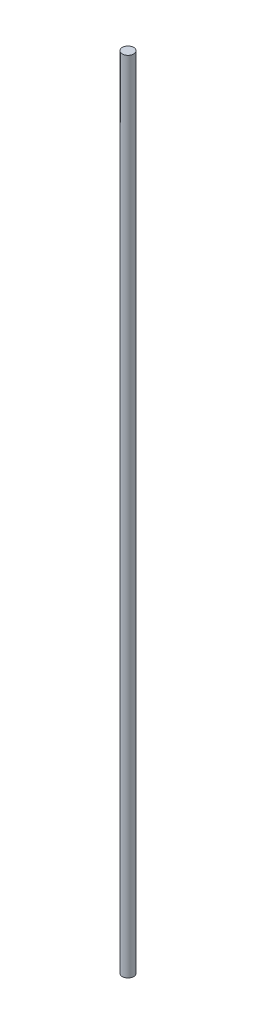
ISO-10303-21;
HEADER;
FILE_DESCRIPTION(('STEP AP214'),'2;1');
FILE_NAME('part.step','',(''),(''),'','','');
FILE_SCHEMA(('AUTOMOTIVE_DESIGN { 1 0 10303 214 1 1 1 1 }'));
ENDSEC;
DATA;
#1=APPLICATION_CONTEXT('core data for automotive mechanical design processes');
#2=APPLICATION_PROTOCOL_DEFINITION('international standard','automotive_design',2000,#1);
#3=PRODUCT_CONTEXT('',#1,'mechanical');
#4=PRODUCT('Part','Part','',(#3));
#5=PRODUCT_RELATED_PRODUCT_CATEGORY('part','',(#4));
#6=PRODUCT_DEFINITION_FORMATION('','',#4);
#7=PRODUCT_DEFINITION_CONTEXT('part definition',#1,'design');
#8=PRODUCT_DEFINITION('design','',#6,#7);
#9=PRODUCT_DEFINITION_SHAPE('','',#8);
#10=(LENGTH_UNIT() NAMED_UNIT(*) SI_UNIT(.MILLI.,.METRE.));
#11=(NAMED_UNIT(*) PLANE_ANGLE_UNIT() SI_UNIT($,.RADIAN.));
#12=(NAMED_UNIT(*) SI_UNIT($,.STERADIAN.) SOLID_ANGLE_UNIT());
#13=UNCERTAINTY_MEASURE_WITH_UNIT(LENGTH_MEASURE(1.E-05),#10,'distance_accuracy_value','');
#14=(GEOMETRIC_REPRESENTATION_CONTEXT(3) GLOBAL_UNCERTAINTY_ASSIGNED_CONTEXT((#13)) GLOBAL_UNIT_ASSIGNED_CONTEXT((#10,
#11,#12)) REPRESENTATION_CONTEXT('',''));
#15=CARTESIAN_POINT('',(0.,0.,0.));
#16=DIRECTION('',(0.,0.,1.));
#17=DIRECTION('',(1.,0.,0.));
#18=AXIS2_PLACEMENT_3D('',#15,#16,#17);
#19=CARTESIAN_POINT('',(0.,-175.,0.));
#20=DIRECTION('',(0.,1.,0.));
#21=DIRECTION('',(0.,0.,1.));
#22=AXIS2_PLACEMENT_3D('',#19,#20,#21);
#23=CYLINDRICAL_SURFACE('',#22,2.5);
#24=CARTESIAN_POINT('',(0.,-175.,0.));
#25=DIRECTION('',(0.,1.,0.));
#26=DIRECTION('',(0.,0.,1.));
#27=AXIS2_PLACEMENT_3D('',#24,#25,#26);
#28=CIRCLE('',#27,2.5);
#29=CARTESIAN_POINT('',(0.,-175.,2.5));
#30=VERTEX_POINT('',#29);
#31=EDGE_CURVE('E10',#30,#30,#28,.T.);
#32=ORIENTED_EDGE('',*,*,#31,.T.);
#33=EDGE_LOOP('',(#32));
#34=FACE_BOUND('',#33,.T.);
#35=CARTESIAN_POINT('',(0.,175.,0.));
#36=DIRECTION('',(0.,1.,0.));
#37=DIRECTION('',(0.,0.,1.));
#38=AXIS2_PLACEMENT_3D('',#35,#36,#37);
#39=CIRCLE('',#38,2.5);
#40=CARTESIAN_POINT('',(0.,175.,2.5));
#41=VERTEX_POINT('',#40);
#42=EDGE_CURVE('E43',#41,#41,#39,.T.);
#43=ORIENTED_EDGE('',*,*,#42,.F.);
#44=EDGE_LOOP('',(#43));
#45=FACE_BOUND('',#44,.T.);
#46=ADVANCED_FACE('F37',(#34,#45),#23,.T.);
#47=CARTESIAN_POINT('',(0.,-175.,0.));
#48=DIRECTION('',(0.,1.,0.));
#49=DIRECTION('',(0.,0.,1.));
#50=AXIS2_PLACEMENT_3D('',#47,#48,#49);
#51=PLANE('',#50);
#52=ORIENTED_EDGE('',*,*,#31,.F.);
#53=EDGE_LOOP('',(#52));
#54=FACE_BOUND('',#53,.T.);
#55=ADVANCED_FACE('F52',(#54),#51,.F.);
#56=CARTESIAN_POINT('',(0.,175.,0.));
#57=DIRECTION('',(0.,1.,0.));
#58=DIRECTION('',(0.,0.,1.));
#59=AXIS2_PLACEMENT_3D('',#56,#57,#58);
#60=PLANE('',#59);
#61=ORIENTED_EDGE('',*,*,#42,.T.);
#62=EDGE_LOOP('',(#61));
#63=FACE_BOUND('',#62,.T.);
#64=ADVANCED_FACE('F49',(#63),#60,.T.);
#65=CLOSED_SHELL('',(#46,#55,#64));
#66=MANIFOLD_SOLID_BREP('B2',#65);
#67=ADVANCED_BREP_SHAPE_REPRESENTATION('',(#18,#66),#14);
#68=SHAPE_DEFINITION_REPRESENTATION(#9,#67);
ENDSEC;
END-ISO-10303-21;
